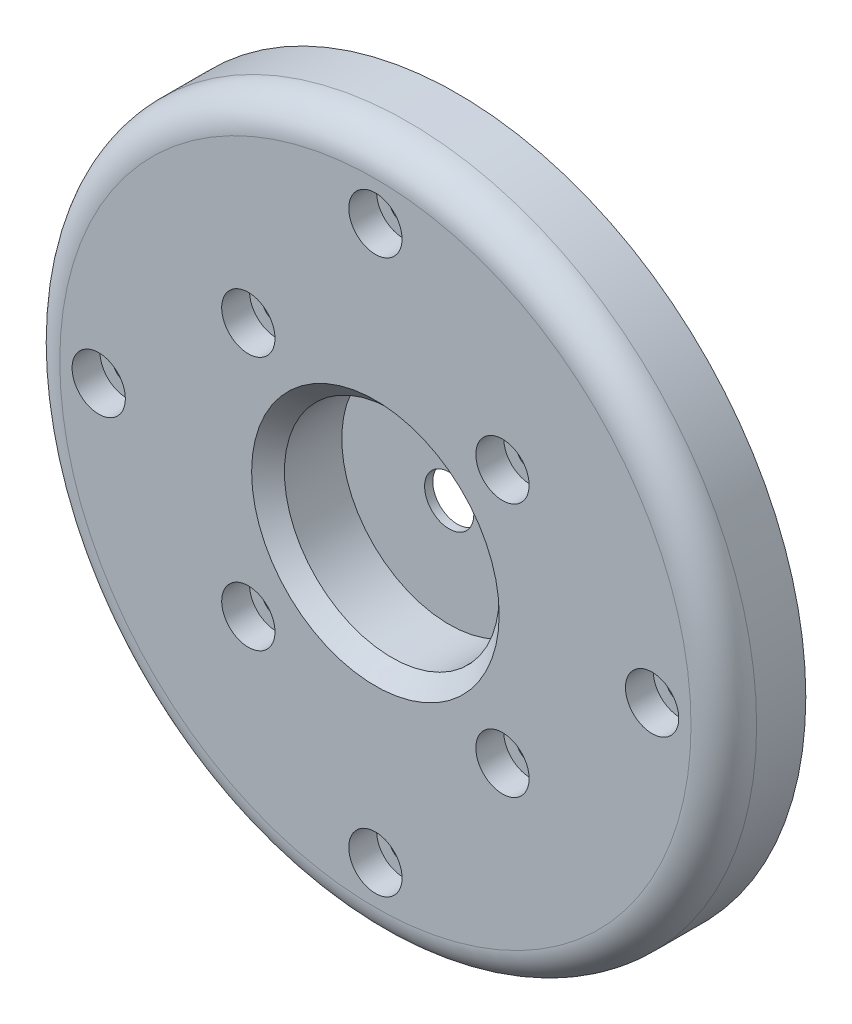
ISO-10303-21;
HEADER;
FILE_DESCRIPTION(('STEP AP214'),'2;1');
FILE_NAME('part.step','',(''),(''),'','','');
FILE_SCHEMA(('AUTOMOTIVE_DESIGN { 1 0 10303 214 1 1 1 1 }'));
ENDSEC;
DATA;
#1=APPLICATION_CONTEXT('core data for automotive mechanical design processes');
#2=APPLICATION_PROTOCOL_DEFINITION('international standard','automotive_design',2000,#1);
#3=PRODUCT_CONTEXT('',#1,'mechanical');
#4=PRODUCT('Part','Part','',(#3));
#5=PRODUCT_RELATED_PRODUCT_CATEGORY('part','',(#4));
#6=PRODUCT_DEFINITION_FORMATION('','',#4);
#7=PRODUCT_DEFINITION_CONTEXT('part definition',#1,'design');
#8=PRODUCT_DEFINITION('design','',#6,#7);
#9=PRODUCT_DEFINITION_SHAPE('','',#8);
#10=(LENGTH_UNIT() NAMED_UNIT(*) SI_UNIT(.MILLI.,.METRE.));
#11=(NAMED_UNIT(*) PLANE_ANGLE_UNIT() SI_UNIT($,.RADIAN.));
#12=(NAMED_UNIT(*) SI_UNIT($,.STERADIAN.) SOLID_ANGLE_UNIT());
#13=UNCERTAINTY_MEASURE_WITH_UNIT(LENGTH_MEASURE(1.E-05),#10,'distance_accuracy_value','');
#14=(GEOMETRIC_REPRESENTATION_CONTEXT(3) GLOBAL_UNCERTAINTY_ASSIGNED_CONTEXT((#13)) GLOBAL_UNIT_ASSIGNED_CONTEXT((#10,
#11,#12)) REPRESENTATION_CONTEXT('',''));
#15=CARTESIAN_POINT('',(0.,0.,0.));
#16=DIRECTION('',(0.,0.,1.));
#17=DIRECTION('',(1.,0.,0.));
#18=AXIS2_PLACEMENT_3D('',#15,#16,#17);
#19=CARTESIAN_POINT('',(0.,0.,-8.48528137423857));
#20=DIRECTION('',(0.,0.,1.));
#21=DIRECTION('',(1.,0.,0.));
#22=AXIS2_PLACEMENT_3D('',#19,#20,#21);
#23=CYLINDRICAL_SURFACE('',#22,3.);
#24=CARTESIAN_POINT('',(0.,0.,0.));
#25=DIRECTION('',(0.,0.,1.));
#26=DIRECTION('',(1.,0.,0.));
#27=AXIS2_PLACEMENT_3D('',#24,#25,#26);
#28=CIRCLE('',#27,3.);
#29=CARTESIAN_POINT('',(3.,0.,0.));
#30=VERTEX_POINT('',#29);
#31=EDGE_CURVE('E70',#30,#30,#28,.F.);
#32=ORIENTED_EDGE('',*,*,#31,.T.);
#33=EDGE_LOOP('',(#32));
#34=FACE_BOUND('',#33,.T.);
#35=CARTESIAN_POINT('',(0.,0.,1.));
#36=DIRECTION('',(0.,0.,1.));
#37=DIRECTION('',(1.,0.,0.));
#38=AXIS2_PLACEMENT_3D('',#35,#36,#37);
#39=CIRCLE('',#38,3.);
#40=CARTESIAN_POINT('',(3.,0.,1.));
#41=VERTEX_POINT('',#40);
#42=EDGE_CURVE('E63',#41,#41,#39,.F.);
#43=ORIENTED_EDGE('',*,*,#42,.F.);
#44=EDGE_LOOP('',(#43));
#45=FACE_BOUND('',#44,.T.);
#46=ADVANCED_FACE('F41',(#34,#45),#23,.F.);
#47=CARTESIAN_POINT('',(0.,0.,10.));
#48=DIRECTION('',(0.,0.,-1.));
#49=DIRECTION('',(-1.,0.,0.));
#50=AXIS2_PLACEMENT_3D('',#47,#48,#49);
#51=CYLINDRICAL_SURFACE('',#50,42.5);
#52=CARTESIAN_POINT('',(0.,0.,6.));
#53=DIRECTION('',(0.,0.,1.));
#54=DIRECTION('',(1.,0.,0.));
#55=AXIS2_PLACEMENT_3D('',#52,#53,#54);
#56=CIRCLE('',#55,42.5);
#57=CARTESIAN_POINT('',(42.5,0.,6.));
#58=VERTEX_POINT('',#57);
#59=EDGE_CURVE('E53',#58,#58,#56,.F.);
#60=ORIENTED_EDGE('',*,*,#59,.T.);
#61=EDGE_LOOP('',(#60));
#62=FACE_BOUND('',#61,.T.);
#63=CARTESIAN_POINT('',(0.,0.,0.));
#64=DIRECTION('',(0.,0.,1.));
#65=DIRECTION('',(1.,0.,0.));
#66=AXIS2_PLACEMENT_3D('',#63,#64,#65);
#67=CIRCLE('',#66,42.5);
#68=CARTESIAN_POINT('',(42.5,0.,0.));
#69=VERTEX_POINT('',#68);
#70=EDGE_CURVE('E62',#69,#69,#67,.T.);
#71=ORIENTED_EDGE('',*,*,#70,.T.);
#72=EDGE_LOOP('',(#71));
#73=FACE_BOUND('',#72,.T.);
#74=ADVANCED_FACE('F189',(#62,#73),#51,.T.);
#75=CARTESIAN_POINT('',(0.,0.,10.));
#76=DIRECTION('',(0.,0.,1.));
#77=DIRECTION('',(1.,0.,0.));
#78=AXIS2_PLACEMENT_3D('',#75,#76,#77);
#79=PLANE('',#78);
#80=CARTESIAN_POINT('',(0.,0.,10.));
#81=DIRECTION('',(0.,0.,1.));
#82=DIRECTION('',(1.,0.,0.));
#83=AXIS2_PLACEMENT_3D('',#80,#81,#82);
#84=CIRCLE('',#83,15.1);
#85=CARTESIAN_POINT('',(15.1,0.,10.));
#86=VERTEX_POINT('',#85);
#87=EDGE_CURVE('E10',#86,#86,#84,.F.);
#88=ORIENTED_EDGE('',*,*,#87,.T.);
#89=EDGE_LOOP('',(#88));
#90=FACE_BOUND('',#89,.T.);
#91=CARTESIAN_POINT('',(0.,0.,10.));
#92=DIRECTION('',(0.,0.,1.));
#93=DIRECTION('',(1.,0.,0.));
#94=AXIS2_PLACEMENT_3D('',#91,#92,#93);
#95=CIRCLE('',#94,38.5);
#96=CARTESIAN_POINT('',(38.5,0.,10.));
#97=VERTEX_POINT('',#96);
#98=EDGE_CURVE('E57',#97,#97,#95,.T.);
#99=ORIENTED_EDGE('',*,*,#98,.T.);
#100=EDGE_LOOP('',(#99));
#101=FACE_BOUND('',#100,.T.);
#102=CARTESIAN_POINT('',(-3.49379302610745E-13,-33.75,10.));
#103=DIRECTION('',(0.,0.,1.));
#104=DIRECTION('',(0.,1.,0.));
#105=AXIS2_PLACEMENT_3D('',#102,#103,#104);
#106=CIRCLE('',#105,3.25);
#107=CARTESIAN_POINT('',(-3.15337359557024E-13,-30.5,10.));
#108=VERTEX_POINT('',#107);
#109=EDGE_CURVE('E104',#108,#108,#106,.T.);
#110=ORIENTED_EDGE('',*,*,#109,.F.);
#111=EDGE_LOOP('',(#110));
#112=FACE_BOUND('',#111,.T.);
#113=CARTESIAN_POINT('',(1.13704312238833E-13,33.75,10.));
#114=DIRECTION('',(0.,0.,1.));
#115=DIRECTION('',(0.,-1.,0.));
#116=AXIS2_PLACEMENT_3D('',#113,#114,#115);
#117=CIRCLE('',#116,3.25);
#118=CARTESIAN_POINT('',(1.02356997887593E-13,30.5,10.));
#119=VERTEX_POINT('',#118);
#120=EDGE_CURVE('E119',#119,#119,#117,.T.);
#121=ORIENTED_EDGE('',*,*,#120,.F.);
#122=EDGE_LOOP('',(#121));
#123=FACE_BOUND('',#122,.T.);
#124=CARTESIAN_POINT('',(15.5,-15.5,10.));
#125=DIRECTION('',(0.,0.,1.));
#126=DIRECTION('',(-1.,0.,0.));
#127=AXIS2_PLACEMENT_3D('',#124,#125,#126);
#128=CIRCLE('',#127,3.25);
#129=CARTESIAN_POINT('',(12.25,-15.5,10.));
#130=VERTEX_POINT('',#129);
#131=EDGE_CURVE('E112',#130,#130,#128,.T.);
#132=ORIENTED_EDGE('',*,*,#131,.F.);
#133=EDGE_LOOP('',(#132));
#134=FACE_BOUND('',#133,.T.);
#135=CARTESIAN_POINT('',(33.75,0.,10.));
#136=DIRECTION('',(0.,0.,1.));
#137=DIRECTION('',(-1.,0.,0.));
#138=AXIS2_PLACEMENT_3D('',#135,#136,#137);
#139=CIRCLE('',#138,3.25);
#140=CARTESIAN_POINT('',(30.5,0.,10.));
#141=VERTEX_POINT('',#140);
#142=EDGE_CURVE('E129',#141,#141,#139,.T.);
#143=ORIENTED_EDGE('',*,*,#142,.F.);
#144=EDGE_LOOP('',(#143));
#145=FACE_BOUND('',#144,.T.);
#146=CARTESIAN_POINT('',(-15.5000000000002,-15.4999999999998,10.));
#147=DIRECTION('',(0.,0.,1.));
#148=DIRECTION('',(0.,1.,0.));
#149=AXIS2_PLACEMENT_3D('',#146,#147,#148);
#150=CIRCLE('',#149,3.25);
#151=CARTESIAN_POINT('',(-15.5000000000001,-12.2499999999998,10.));
#152=VERTEX_POINT('',#151);
#153=EDGE_CURVE('E111',#152,#152,#150,.T.);
#154=ORIENTED_EDGE('',*,*,#153,.F.);
#155=EDGE_LOOP('',(#154));
#156=FACE_BOUND('',#155,.T.);
#157=CARTESIAN_POINT('',(15.5000000000001,15.4999999999999,10.));
#158=DIRECTION('',(0.,0.,1.));
#159=DIRECTION('',(0.,-1.,0.));
#160=AXIS2_PLACEMENT_3D('',#157,#158,#159);
#161=CIRCLE('',#160,3.25);
#162=CARTESIAN_POINT('',(15.5,12.2499999999999,10.));
#163=VERTEX_POINT('',#162);
#164=EDGE_CURVE('E98',#163,#163,#161,.T.);
#165=ORIENTED_EDGE('',*,*,#164,.F.);
#166=EDGE_LOOP('',(#165));
#167=FACE_BOUND('',#166,.T.);
#168=CARTESIAN_POINT('',(-15.5,15.5,10.));
#169=DIRECTION('',(0.,0.,1.));
#170=DIRECTION('',(1.,0.,0.));
#171=AXIS2_PLACEMENT_3D('',#168,#169,#170);
#172=CIRCLE('',#171,3.25);
#173=CARTESIAN_POINT('',(-12.25,15.5,10.));
#174=VERTEX_POINT('',#173);
#175=EDGE_CURVE('E81',#174,#174,#172,.T.);
#176=ORIENTED_EDGE('',*,*,#175,.F.);
#177=EDGE_LOOP('',(#176));
#178=FACE_BOUND('',#177,.T.);
#179=CARTESIAN_POINT('',(-33.75,0.,10.));
#180=DIRECTION('',(0.,0.,1.));
#181=DIRECTION('',(1.,0.,0.));
#182=AXIS2_PLACEMENT_3D('',#179,#180,#181);
#183=CIRCLE('',#182,3.25);
#184=CARTESIAN_POINT('',(-30.5,0.,10.));
#185=VERTEX_POINT('',#184);
#186=EDGE_CURVE('E77',#185,#185,#183,.T.);
#187=ORIENTED_EDGE('',*,*,#186,.F.);
#188=EDGE_LOOP('',(#187));
#189=FACE_BOUND('',#188,.T.);
#190=ADVANCED_FACE('F196',(#90,#101,#112,#123,#134,#145,#156,#167,#178,#189),#79,.T.);
#191=CARTESIAN_POINT('',(0.,0.,0.));
#192=DIRECTION('',(0.,0.,1.));
#193=DIRECTION('',(1.,0.,0.));
#194=AXIS2_PLACEMENT_3D('',#191,#192,#193);
#195=PLANE('',#194);
#196=CARTESIAN_POINT('',(-3.49379302610745E-13,-33.75,0.));
#197=DIRECTION('',(0.,0.,1.));
#198=DIRECTION('',(1.,0.,0.));
#199=AXIS2_PLACEMENT_3D('',#196,#197,#198);
#200=CIRCLE('',#199,1.7);
#201=CARTESIAN_POINT('',(1.69999999999965,-33.75,0.));
#202=VERTEX_POINT('',#201);
#203=EDGE_CURVE('E140',#202,#202,#200,.F.);
#204=ORIENTED_EDGE('',*,*,#203,.F.);
#205=EDGE_LOOP('',(#204));
#206=FACE_BOUND('',#205,.T.);
#207=CARTESIAN_POINT('',(1.13704312238833E-13,33.75,0.));
#208=DIRECTION('',(0.,0.,1.));
#209=DIRECTION('',(1.,0.,0.));
#210=AXIS2_PLACEMENT_3D('',#207,#208,#209);
#211=CIRCLE('',#210,1.7);
#212=CARTESIAN_POINT('',(1.70000000000011,33.75,0.));
#213=VERTEX_POINT('',#212);
#214=EDGE_CURVE('E139',#213,#213,#211,.F.);
#215=ORIENTED_EDGE('',*,*,#214,.F.);
#216=EDGE_LOOP('',(#215));
#217=FACE_BOUND('',#216,.T.);
#218=CARTESIAN_POINT('',(15.5,-15.5,0.));
#219=DIRECTION('',(0.,0.,1.));
#220=DIRECTION('',(1.,0.,0.));
#221=AXIS2_PLACEMENT_3D('',#218,#219,#220);
#222=CIRCLE('',#221,1.7);
#223=CARTESIAN_POINT('',(17.2,-15.5,0.));
#224=VERTEX_POINT('',#223);
#225=EDGE_CURVE('E146',#224,#224,#222,.F.);
#226=ORIENTED_EDGE('',*,*,#225,.F.);
#227=EDGE_LOOP('',(#226));
#228=FACE_BOUND('',#227,.T.);
#229=CARTESIAN_POINT('',(33.75,0.,0.));
#230=DIRECTION('',(0.,0.,1.));
#231=DIRECTION('',(1.,0.,0.));
#232=AXIS2_PLACEMENT_3D('',#229,#230,#231);
#233=CIRCLE('',#232,1.7);
#234=CARTESIAN_POINT('',(35.45,0.,0.));
#235=VERTEX_POINT('',#234);
#236=EDGE_CURVE('E153',#235,#235,#233,.F.);
#237=ORIENTED_EDGE('',*,*,#236,.F.);
#238=EDGE_LOOP('',(#237));
#239=FACE_BOUND('',#238,.T.);
#240=CARTESIAN_POINT('',(-15.5000000000002,-15.4999999999998,0.));
#241=DIRECTION('',(0.,0.,1.));
#242=DIRECTION('',(1.,0.,0.));
#243=AXIS2_PLACEMENT_3D('',#240,#241,#242);
#244=CIRCLE('',#243,1.7);
#245=CARTESIAN_POINT('',(-13.8000000000002,-15.4999999999998,0.));
#246=VERTEX_POINT('',#245);
#247=EDGE_CURVE('E158',#246,#246,#244,.F.);
#248=ORIENTED_EDGE('',*,*,#247,.F.);
#249=EDGE_LOOP('',(#248));
#250=FACE_BOUND('',#249,.T.);
#251=CARTESIAN_POINT('',(15.5000000000001,15.4999999999999,0.));
#252=DIRECTION('',(0.,0.,1.));
#253=DIRECTION('',(1.,0.,0.));
#254=AXIS2_PLACEMENT_3D('',#251,#252,#253);
#255=CIRCLE('',#254,1.7);
#256=CARTESIAN_POINT('',(17.2000000000001,15.4999999999999,0.));
#257=VERTEX_POINT('',#256);
#258=EDGE_CURVE('E108',#257,#257,#255,.F.);
#259=ORIENTED_EDGE('',*,*,#258,.F.);
#260=EDGE_LOOP('',(#259));
#261=FACE_BOUND('',#260,.T.);
#262=CARTESIAN_POINT('',(-15.5,15.5,0.));
#263=DIRECTION('',(0.,0.,1.));
#264=DIRECTION('',(1.,0.,0.));
#265=AXIS2_PLACEMENT_3D('',#262,#263,#264);
#266=CIRCLE('',#265,1.7);
#267=CARTESIAN_POINT('',(-13.8,15.5,0.));
#268=VERTEX_POINT('',#267);
#269=EDGE_CURVE('E78',#268,#268,#266,.F.);
#270=ORIENTED_EDGE('',*,*,#269,.F.);
#271=EDGE_LOOP('',(#270));
#272=FACE_BOUND('',#271,.T.);
#273=CARTESIAN_POINT('',(-33.75,0.,0.));
#274=DIRECTION('',(0.,0.,1.));
#275=DIRECTION('',(1.,0.,0.));
#276=AXIS2_PLACEMENT_3D('',#273,#274,#275);
#277=CIRCLE('',#276,1.7);
#278=CARTESIAN_POINT('',(-32.05,0.,0.));
#279=VERTEX_POINT('',#278);
#280=EDGE_CURVE('E90',#279,#279,#277,.F.);
#281=ORIENTED_EDGE('',*,*,#280,.F.);
#282=EDGE_LOOP('',(#281));
#283=FACE_BOUND('',#282,.T.);
#284=ORIENTED_EDGE('',*,*,#31,.F.);
#285=EDGE_LOOP('',(#284));
#286=FACE_BOUND('',#285,.T.);
#287=ORIENTED_EDGE('',*,*,#70,.F.);
#288=EDGE_LOOP('',(#287));
#289=FACE_BOUND('',#288,.T.);
#290=ADVANCED_FACE('F205',(#206,#217,#228,#239,#250,#261,#272,#283,#286,#289),#195,.F.);
#291=CARTESIAN_POINT('',(-33.75,0.,6.6));
#292=DIRECTION('',(0.,0.,1.));
#293=DIRECTION('',(1.,0.,0.));
#294=AXIS2_PLACEMENT_3D('',#291,#292,#293);
#295=CYLINDRICAL_SURFACE('',#294,3.25);
#296=CARTESIAN_POINT('',(-33.75,0.,6.6));
#297=DIRECTION('',(0.,0.,1.));
#298=DIRECTION('',(1.,0.,0.));
#299=AXIS2_PLACEMENT_3D('',#296,#297,#298);
#300=CIRCLE('',#299,3.25);
#301=CARTESIAN_POINT('',(-30.5,0.,6.6));
#302=VERTEX_POINT('',#301);
#303=EDGE_CURVE('E74',#302,#302,#300,.T.);
#304=ORIENTED_EDGE('',*,*,#303,.F.);
#305=EDGE_LOOP('',(#304));
#306=FACE_BOUND('',#305,.T.);
#307=ORIENTED_EDGE('',*,*,#186,.T.);
#308=EDGE_LOOP('',(#307));
#309=FACE_BOUND('',#308,.T.);
#310=ADVANCED_FACE('F207',(#306,#309),#295,.F.);
#311=CARTESIAN_POINT('',(-33.75,0.,6.6));
#312=DIRECTION('',(0.,0.,1.));
#313=DIRECTION('',(1.,0.,0.));
#314=AXIS2_PLACEMENT_3D('',#311,#312,#313);
#315=PLANE('',#314);
#316=CARTESIAN_POINT('',(-33.75,0.,6.6));
#317=DIRECTION('',(0.,0.,1.));
#318=DIRECTION('',(1.,0.,0.));
#319=AXIS2_PLACEMENT_3D('',#316,#317,#318);
#320=CIRCLE('',#319,1.7);
#321=CARTESIAN_POINT('',(-32.05,0.,6.6));
#322=VERTEX_POINT('',#321);
#323=EDGE_CURVE('E86',#322,#322,#320,.T.);
#324=ORIENTED_EDGE('',*,*,#323,.F.);
#325=EDGE_LOOP('',(#324));
#326=FACE_BOUND('',#325,.T.);
#327=ORIENTED_EDGE('',*,*,#303,.T.);
#328=EDGE_LOOP('',(#327));
#329=FACE_BOUND('',#328,.T.);
#330=ADVANCED_FACE('F202',(#326,#329),#315,.T.);
#331=CARTESIAN_POINT('',(-15.5,15.5,6.6));
#332=DIRECTION('',(0.,0.,1.));
#333=DIRECTION('',(1.,0.,0.));
#334=AXIS2_PLACEMENT_3D('',#331,#332,#333);
#335=CYLINDRICAL_SURFACE('',#334,3.25);
#336=CARTESIAN_POINT('',(-15.5,15.5,6.6));
#337=DIRECTION('',(0.,0.,1.));
#338=DIRECTION('',(1.,0.,0.));
#339=AXIS2_PLACEMENT_3D('',#336,#337,#338);
#340=CIRCLE('',#339,3.25);
#341=CARTESIAN_POINT('',(-12.25,15.5,6.6));
#342=VERTEX_POINT('',#341);
#343=EDGE_CURVE('E73',#342,#342,#340,.T.);
#344=ORIENTED_EDGE('',*,*,#343,.F.);
#345=EDGE_LOOP('',(#344));
#346=FACE_BOUND('',#345,.T.);
#347=ORIENTED_EDGE('',*,*,#175,.T.);
#348=EDGE_LOOP('',(#347));
#349=FACE_BOUND('',#348,.T.);
#350=ADVANCED_FACE('F246',(#346,#349),#335,.F.);
#351=CARTESIAN_POINT('',(-15.5,15.5,6.6));
#352=DIRECTION('',(0.,0.,1.));
#353=DIRECTION('',(1.,0.,0.));
#354=AXIS2_PLACEMENT_3D('',#351,#352,#353);
#355=PLANE('',#354);
#356=CARTESIAN_POINT('',(-15.5,15.5,6.6));
#357=DIRECTION('',(0.,0.,1.));
#358=DIRECTION('',(1.,0.,0.));
#359=AXIS2_PLACEMENT_3D('',#356,#357,#358);
#360=CIRCLE('',#359,1.7);
#361=CARTESIAN_POINT('',(-13.8,15.5,6.6));
#362=VERTEX_POINT('',#361);
#363=EDGE_CURVE('E89',#362,#362,#360,.T.);
#364=ORIENTED_EDGE('',*,*,#363,.F.);
#365=EDGE_LOOP('',(#364));
#366=FACE_BOUND('',#365,.T.);
#367=ORIENTED_EDGE('',*,*,#343,.T.);
#368=EDGE_LOOP('',(#367));
#369=FACE_BOUND('',#368,.T.);
#370=ADVANCED_FACE('F240',(#366,#369),#355,.T.);
#371=CARTESIAN_POINT('',(-33.75,0.,-4.80832611206852));
#372=DIRECTION('',(0.,0.,1.));
#373=DIRECTION('',(1.,0.,0.));
#374=AXIS2_PLACEMENT_3D('',#371,#372,#373);
#375=CYLINDRICAL_SURFACE('',#374,1.7);
#376=ORIENTED_EDGE('',*,*,#280,.T.);
#377=EDGE_LOOP('',(#376));
#378=FACE_BOUND('',#377,.T.);
#379=ORIENTED_EDGE('',*,*,#323,.T.);
#380=EDGE_LOOP('',(#379));
#381=FACE_BOUND('',#380,.T.);
#382=ADVANCED_FACE('F236',(#378,#381),#375,.F.);
#383=CARTESIAN_POINT('',(-15.5,15.5,-4.80832611206852));
#384=DIRECTION('',(0.,0.,1.));
#385=DIRECTION('',(1.,0.,0.));
#386=AXIS2_PLACEMENT_3D('',#383,#384,#385);
#387=CYLINDRICAL_SURFACE('',#386,1.7);
#388=ORIENTED_EDGE('',*,*,#269,.T.);
#389=EDGE_LOOP('',(#388));
#390=FACE_BOUND('',#389,.T.);
#391=ORIENTED_EDGE('',*,*,#363,.T.);
#392=EDGE_LOOP('',(#391));
#393=FACE_BOUND('',#392,.T.);
#394=ADVANCED_FACE('F239',(#390,#393),#387,.F.);
#395=CARTESIAN_POINT('',(15.5000000000001,15.4999999999999,6.6));
#396=DIRECTION('',(0.,0.,1.));
#397=DIRECTION('',(1.,0.,0.));
#398=AXIS2_PLACEMENT_3D('',#395,#396,#397);
#399=CYLINDRICAL_SURFACE('',#398,3.25);
#400=CARTESIAN_POINT('',(15.5000000000001,15.4999999999999,6.6));
#401=DIRECTION('',(0.,0.,1.));
#402=DIRECTION('',(0.,-1.,0.));
#403=AXIS2_PLACEMENT_3D('',#400,#401,#402);
#404=CIRCLE('',#403,3.25);
#405=CARTESIAN_POINT('',(15.5,12.2499999999999,6.6));
#406=VERTEX_POINT('',#405);
#407=EDGE_CURVE('E93',#406,#406,#404,.T.);
#408=ORIENTED_EDGE('',*,*,#407,.F.);
#409=EDGE_LOOP('',(#408));
#410=FACE_BOUND('',#409,.T.);
#411=ORIENTED_EDGE('',*,*,#164,.T.);
#412=EDGE_LOOP('',(#411));
#413=FACE_BOUND('',#412,.T.);
#414=ADVANCED_FACE('F265',(#410,#413),#399,.F.);
#415=CARTESIAN_POINT('',(15.5000000000001,15.4999999999999,6.6));
#416=DIRECTION('',(0.,0.,1.));
#417=DIRECTION('',(0.,-1.,0.));
#418=AXIS2_PLACEMENT_3D('',#415,#416,#417);
#419=PLANE('',#418);
#420=CARTESIAN_POINT('',(15.5000000000001,15.4999999999999,6.6));
#421=DIRECTION('',(0.,0.,1.));
#422=DIRECTION('',(0.,-1.,0.));
#423=AXIS2_PLACEMENT_3D('',#420,#421,#422);
#424=CIRCLE('',#423,1.7);
#425=CARTESIAN_POINT('',(15.5000000000001,13.7999999999999,6.6));
#426=VERTEX_POINT('',#425);
#427=EDGE_CURVE('E136',#426,#426,#424,.T.);
#428=ORIENTED_EDGE('',*,*,#427,.F.);
#429=EDGE_LOOP('',(#428));
#430=FACE_BOUND('',#429,.T.);
#431=ORIENTED_EDGE('',*,*,#407,.T.);
#432=EDGE_LOOP('',(#431));
#433=FACE_BOUND('',#432,.T.);
#434=ADVANCED_FACE('F268',(#430,#433),#419,.T.);
#435=CARTESIAN_POINT('',(-15.5000000000002,-15.4999999999998,6.6));
#436=DIRECTION('',(0.,0.,1.));
#437=DIRECTION('',(1.,0.,0.));
#438=AXIS2_PLACEMENT_3D('',#435,#436,#437);
#439=CYLINDRICAL_SURFACE('',#438,3.25);
#440=CARTESIAN_POINT('',(-15.5000000000002,-15.4999999999998,6.6));
#441=DIRECTION('',(0.,0.,1.));
#442=DIRECTION('',(0.,1.,0.));
#443=AXIS2_PLACEMENT_3D('',#440,#441,#442);
#444=CIRCLE('',#443,3.25);
#445=CARTESIAN_POINT('',(-15.5000000000001,-12.2499999999998,6.6));
#446=VERTEX_POINT('',#445);
#447=EDGE_CURVE('E126',#446,#446,#444,.T.);
#448=ORIENTED_EDGE('',*,*,#447,.F.);
#449=EDGE_LOOP('',(#448));
#450=FACE_BOUND('',#449,.T.);
#451=ORIENTED_EDGE('',*,*,#153,.T.);
#452=EDGE_LOOP('',(#451));
#453=FACE_BOUND('',#452,.T.);
#454=ADVANCED_FACE('F272',(#450,#453),#439,.F.);
#455=CARTESIAN_POINT('',(-15.5000000000002,-15.4999999999998,6.6));
#456=DIRECTION('',(0.,0.,1.));
#457=DIRECTION('',(0.,1.,0.));
#458=AXIS2_PLACEMENT_3D('',#455,#456,#457);
#459=PLANE('',#458);
#460=CARTESIAN_POINT('',(-15.5000000000002,-15.4999999999998,6.6));
#461=DIRECTION('',(0.,0.,1.));
#462=DIRECTION('',(0.,1.,0.));
#463=AXIS2_PLACEMENT_3D('',#460,#461,#462);
#464=CIRCLE('',#463,1.7);
#465=CARTESIAN_POINT('',(-15.5000000000001,-13.7999999999998,6.6));
#466=VERTEX_POINT('',#465);
#467=EDGE_CURVE('E143',#466,#466,#464,.T.);
#468=ORIENTED_EDGE('',*,*,#467,.F.);
#469=EDGE_LOOP('',(#468));
#470=FACE_BOUND('',#469,.T.);
#471=ORIENTED_EDGE('',*,*,#447,.T.);
#472=EDGE_LOOP('',(#471));
#473=FACE_BOUND('',#472,.T.);
#474=ADVANCED_FACE('F302',(#470,#473),#459,.T.);
#475=CARTESIAN_POINT('',(33.75,0.,6.6));
#476=DIRECTION('',(0.,0.,1.));
#477=DIRECTION('',(1.,0.,0.));
#478=AXIS2_PLACEMENT_3D('',#475,#476,#477);
#479=CYLINDRICAL_SURFACE('',#478,3.25);
#480=CARTESIAN_POINT('',(33.75,0.,6.6));
#481=DIRECTION('',(0.,0.,1.));
#482=DIRECTION('',(-1.,0.,0.));
#483=AXIS2_PLACEMENT_3D('',#480,#481,#482);
#484=CIRCLE('',#483,3.25);
#485=CARTESIAN_POINT('',(30.5,0.,6.6));
#486=VERTEX_POINT('',#485);
#487=EDGE_CURVE('E116',#486,#486,#484,.T.);
#488=ORIENTED_EDGE('',*,*,#487,.F.);
#489=EDGE_LOOP('',(#488));
#490=FACE_BOUND('',#489,.T.);
#491=ORIENTED_EDGE('',*,*,#142,.T.);
#492=EDGE_LOOP('',(#491));
#493=FACE_BOUND('',#492,.T.);
#494=ADVANCED_FACE('F306',(#490,#493),#479,.F.);
#495=CARTESIAN_POINT('',(33.75,0.,6.6));
#496=DIRECTION('',(0.,0.,1.));
#497=DIRECTION('',(-1.,0.,0.));
#498=AXIS2_PLACEMENT_3D('',#495,#496,#497);
#499=PLANE('',#498);
#500=CARTESIAN_POINT('',(33.75,0.,6.6));
#501=DIRECTION('',(0.,0.,1.));
#502=DIRECTION('',(-1.,0.,0.));
#503=AXIS2_PLACEMENT_3D('',#500,#501,#502);
#504=CIRCLE('',#503,1.7);
#505=CARTESIAN_POINT('',(32.05,0.,6.6));
#506=VERTEX_POINT('',#505);
#507=EDGE_CURVE('E161',#506,#506,#504,.T.);
#508=ORIENTED_EDGE('',*,*,#507,.F.);
#509=EDGE_LOOP('',(#508));
#510=FACE_BOUND('',#509,.T.);
#511=ORIENTED_EDGE('',*,*,#487,.T.);
#512=EDGE_LOOP('',(#511));
#513=FACE_BOUND('',#512,.T.);
#514=ADVANCED_FACE('F288',(#510,#513),#499,.T.);
#515=CARTESIAN_POINT('',(15.5,-15.5,6.6));
#516=DIRECTION('',(0.,0.,1.));
#517=DIRECTION('',(1.,0.,0.));
#518=AXIS2_PLACEMENT_3D('',#515,#516,#517);
#519=CYLINDRICAL_SURFACE('',#518,3.25);
#520=CARTESIAN_POINT('',(15.5,-15.5,6.6));
#521=DIRECTION('',(0.,0.,1.));
#522=DIRECTION('',(-1.,0.,0.));
#523=AXIS2_PLACEMENT_3D('',#520,#521,#522);
#524=CIRCLE('',#523,3.25);
#525=CARTESIAN_POINT('',(12.25,-15.5,6.6));
#526=VERTEX_POINT('',#525);
#527=EDGE_CURVE('E115',#526,#526,#524,.T.);
#528=ORIENTED_EDGE('',*,*,#527,.F.);
#529=EDGE_LOOP('',(#528));
#530=FACE_BOUND('',#529,.T.);
#531=ORIENTED_EDGE('',*,*,#131,.T.);
#532=EDGE_LOOP('',(#531));
#533=FACE_BOUND('',#532,.T.);
#534=ADVANCED_FACE('F284',(#530,#533),#519,.F.);
#535=CARTESIAN_POINT('',(15.5,-15.5,6.6));
#536=DIRECTION('',(0.,0.,1.));
#537=DIRECTION('',(-1.,0.,0.));
#538=AXIS2_PLACEMENT_3D('',#535,#536,#537);
#539=PLANE('',#538);
#540=CARTESIAN_POINT('',(15.5,-15.5,6.6));
#541=DIRECTION('',(0.,0.,1.));
#542=DIRECTION('',(-1.,0.,0.));
#543=AXIS2_PLACEMENT_3D('',#540,#541,#542);
#544=CIRCLE('',#543,1.7);
#545=CARTESIAN_POINT('',(13.8,-15.5,6.6));
#546=VERTEX_POINT('',#545);
#547=EDGE_CURVE('E150',#546,#546,#544,.T.);
#548=ORIENTED_EDGE('',*,*,#547,.F.);
#549=EDGE_LOOP('',(#548));
#550=FACE_BOUND('',#549,.T.);
#551=ORIENTED_EDGE('',*,*,#527,.T.);
#552=EDGE_LOOP('',(#551));
#553=FACE_BOUND('',#552,.T.);
#554=ADVANCED_FACE('F287',(#550,#553),#539,.T.);
#555=CARTESIAN_POINT('',(1.13704312238833E-13,33.75,6.6));
#556=DIRECTION('',(0.,0.,1.));
#557=DIRECTION('',(1.,0.,0.));
#558=AXIS2_PLACEMENT_3D('',#555,#556,#557);
#559=CYLINDRICAL_SURFACE('',#558,3.25);
#560=CARTESIAN_POINT('',(1.13704312238833E-13,33.75,6.6));
#561=DIRECTION('',(0.,0.,1.));
#562=DIRECTION('',(0.,-1.,0.));
#563=AXIS2_PLACEMENT_3D('',#560,#561,#562);
#564=CIRCLE('',#563,3.25);
#565=CARTESIAN_POINT('',(1.02356997887593E-13,30.5,6.6));
#566=VERTEX_POINT('',#565);
#567=EDGE_CURVE('E101',#566,#566,#564,.T.);
#568=ORIENTED_EDGE('',*,*,#567,.F.);
#569=EDGE_LOOP('',(#568));
#570=FACE_BOUND('',#569,.T.);
#571=ORIENTED_EDGE('',*,*,#120,.T.);
#572=EDGE_LOOP('',(#571));
#573=FACE_BOUND('',#572,.T.);
#574=ADVANCED_FACE('F292',(#570,#573),#559,.F.);
#575=CARTESIAN_POINT('',(1.13704312238833E-13,33.75,6.6));
#576=DIRECTION('',(0.,0.,1.));
#577=DIRECTION('',(0.,-1.,0.));
#578=AXIS2_PLACEMENT_3D('',#575,#576,#577);
#579=PLANE('',#578);
#580=CARTESIAN_POINT('',(1.13704312238833E-13,33.75,6.6));
#581=DIRECTION('',(0.,0.,1.));
#582=DIRECTION('',(0.,-1.,0.));
#583=AXIS2_PLACEMENT_3D('',#580,#581,#582);
#584=CIRCLE('',#583,1.7);
#585=CARTESIAN_POINT('',(1.077687939628E-13,32.05,6.6));
#586=VERTEX_POINT('',#585);
#587=EDGE_CURVE('E149',#586,#586,#584,.T.);
#588=ORIENTED_EDGE('',*,*,#587,.F.);
#589=EDGE_LOOP('',(#588));
#590=FACE_BOUND('',#589,.T.);
#591=ORIENTED_EDGE('',*,*,#567,.T.);
#592=EDGE_LOOP('',(#591));
#593=FACE_BOUND('',#592,.T.);
#594=ADVANCED_FACE('F278',(#590,#593),#579,.T.);
#595=CARTESIAN_POINT('',(-3.49379302610745E-13,-33.75,6.6));
#596=DIRECTION('',(0.,0.,1.));
#597=DIRECTION('',(1.,0.,0.));
#598=AXIS2_PLACEMENT_3D('',#595,#596,#597);
#599=CYLINDRICAL_SURFACE('',#598,3.25);
#600=CARTESIAN_POINT('',(-3.49379302610745E-13,-33.75,6.6));
#601=DIRECTION('',(0.,0.,1.));
#602=DIRECTION('',(0.,1.,0.));
#603=AXIS2_PLACEMENT_3D('',#600,#601,#602);
#604=CIRCLE('',#603,3.25);
#605=CARTESIAN_POINT('',(-3.15337359557024E-13,-30.5,6.6));
#606=VERTEX_POINT('',#605);
#607=EDGE_CURVE('E107',#606,#606,#604,.T.);
#608=ORIENTED_EDGE('',*,*,#607,.F.);
#609=EDGE_LOOP('',(#608));
#610=FACE_BOUND('',#609,.T.);
#611=ORIENTED_EDGE('',*,*,#109,.T.);
#612=EDGE_LOOP('',(#611));
#613=FACE_BOUND('',#612,.T.);
#614=ADVANCED_FACE('F274',(#610,#613),#599,.F.);
#615=CARTESIAN_POINT('',(-3.49379302610745E-13,-33.75,6.6));
#616=DIRECTION('',(0.,0.,1.));
#617=DIRECTION('',(0.,1.,0.));
#618=AXIS2_PLACEMENT_3D('',#615,#616,#617);
#619=PLANE('',#618);
#620=CARTESIAN_POINT('',(-3.49379302610745E-13,-33.75,6.6));
#621=DIRECTION('',(0.,0.,1.));
#622=DIRECTION('',(0.,1.,0.));
#623=AXIS2_PLACEMENT_3D('',#620,#621,#622);
#624=CIRCLE('',#623,1.7);
#625=CARTESIAN_POINT('',(-3.31572747782645E-13,-32.05,6.6));
#626=VERTEX_POINT('',#625);
#627=EDGE_CURVE('E66',#626,#626,#624,.T.);
#628=ORIENTED_EDGE('',*,*,#627,.F.);
#629=EDGE_LOOP('',(#628));
#630=FACE_BOUND('',#629,.T.);
#631=ORIENTED_EDGE('',*,*,#607,.T.);
#632=EDGE_LOOP('',(#631));
#633=FACE_BOUND('',#632,.T.);
#634=ADVANCED_FACE('F277',(#630,#633),#619,.T.);
#635=CARTESIAN_POINT('',(15.5000000000001,15.4999999999999,-4.80832611206852));
#636=DIRECTION('',(0.,0.,1.));
#637=DIRECTION('',(1.,0.,0.));
#638=AXIS2_PLACEMENT_3D('',#635,#636,#637);
#639=CYLINDRICAL_SURFACE('',#638,1.7);
#640=ORIENTED_EDGE('',*,*,#258,.T.);
#641=EDGE_LOOP('',(#640));
#642=FACE_BOUND('',#641,.T.);
#643=ORIENTED_EDGE('',*,*,#427,.T.);
#644=EDGE_LOOP('',(#643));
#645=FACE_BOUND('',#644,.T.);
#646=ADVANCED_FACE('F282',(#642,#645),#639,.F.);
#647=CARTESIAN_POINT('',(-15.5000000000002,-15.4999999999998,-4.80832611206852));
#648=DIRECTION('',(0.,0.,1.));
#649=DIRECTION('',(1.,0.,0.));
#650=AXIS2_PLACEMENT_3D('',#647,#648,#649);
#651=CYLINDRICAL_SURFACE('',#650,1.7);
#652=ORIENTED_EDGE('',*,*,#247,.T.);
#653=EDGE_LOOP('',(#652));
#654=FACE_BOUND('',#653,.T.);
#655=ORIENTED_EDGE('',*,*,#467,.T.);
#656=EDGE_LOOP('',(#655));
#657=FACE_BOUND('',#656,.T.);
#658=ADVANCED_FACE('F316',(#654,#657),#651,.F.);
#659=CARTESIAN_POINT('',(33.75,0.,-4.80832611206852));
#660=DIRECTION('',(0.,0.,1.));
#661=DIRECTION('',(1.,0.,0.));
#662=AXIS2_PLACEMENT_3D('',#659,#660,#661);
#663=CYLINDRICAL_SURFACE('',#662,1.7);
#664=ORIENTED_EDGE('',*,*,#236,.T.);
#665=EDGE_LOOP('',(#664));
#666=FACE_BOUND('',#665,.T.);
#667=ORIENTED_EDGE('',*,*,#507,.T.);
#668=EDGE_LOOP('',(#667));
#669=FACE_BOUND('',#668,.T.);
#670=ADVANCED_FACE('F324',(#666,#669),#663,.F.);
#671=CARTESIAN_POINT('',(15.5,-15.5,-4.80832611206852));
#672=DIRECTION('',(0.,0.,1.));
#673=DIRECTION('',(1.,0.,0.));
#674=AXIS2_PLACEMENT_3D('',#671,#672,#673);
#675=CYLINDRICAL_SURFACE('',#674,1.7);
#676=ORIENTED_EDGE('',*,*,#225,.T.);
#677=EDGE_LOOP('',(#676));
#678=FACE_BOUND('',#677,.T.);
#679=ORIENTED_EDGE('',*,*,#547,.T.);
#680=EDGE_LOOP('',(#679));
#681=FACE_BOUND('',#680,.T.);
#682=ADVANCED_FACE('F321',(#678,#681),#675,.F.);
#683=CARTESIAN_POINT('',(1.13704312238833E-13,33.75,-4.80832611206852));
#684=DIRECTION('',(0.,0.,1.));
#685=DIRECTION('',(1.,0.,0.));
#686=AXIS2_PLACEMENT_3D('',#683,#684,#685);
#687=CYLINDRICAL_SURFACE('',#686,1.7);
#688=ORIENTED_EDGE('',*,*,#214,.T.);
#689=EDGE_LOOP('',(#688));
#690=FACE_BOUND('',#689,.T.);
#691=ORIENTED_EDGE('',*,*,#587,.T.);
#692=EDGE_LOOP('',(#691));
#693=FACE_BOUND('',#692,.T.);
#694=ADVANCED_FACE('F319',(#690,#693),#687,.F.);
#695=CARTESIAN_POINT('',(-3.49379302610745E-13,-33.75,-4.80832611206852));
#696=DIRECTION('',(0.,0.,1.));
#697=DIRECTION('',(1.,0.,0.));
#698=AXIS2_PLACEMENT_3D('',#695,#696,#697);
#699=CYLINDRICAL_SURFACE('',#698,1.7);
#700=ORIENTED_EDGE('',*,*,#203,.T.);
#701=EDGE_LOOP('',(#700));
#702=FACE_BOUND('',#701,.T.);
#703=ORIENTED_EDGE('',*,*,#627,.T.);
#704=EDGE_LOOP('',(#703));
#705=FACE_BOUND('',#704,.T.);
#706=ADVANCED_FACE('F185',(#702,#705),#699,.F.);
#707=CARTESIAN_POINT('',(0.,0.,1.));
#708=DIRECTION('',(0.,0.,1.));
#709=DIRECTION('',(1.,0.,0.));
#710=AXIS2_PLACEMENT_3D('',#707,#708,#709);
#711=PLANE('',#710);
#712=CARTESIAN_POINT('',(0.,0.,1.));
#713=DIRECTION('',(0.,0.,1.));
#714=DIRECTION('',(1.,0.,0.));
#715=AXIS2_PLACEMENT_3D('',#712,#713,#714);
#716=CIRCLE('',#715,13.1);
#717=CARTESIAN_POINT('',(13.1,0.,1.));
#718=VERTEX_POINT('',#717);
#719=EDGE_CURVE('E67',#718,#718,#716,.T.);
#720=ORIENTED_EDGE('',*,*,#719,.T.);
#721=EDGE_LOOP('',(#720));
#722=FACE_BOUND('',#721,.T.);
#723=ORIENTED_EDGE('',*,*,#42,.T.);
#724=EDGE_LOOP('',(#723));
#725=FACE_BOUND('',#724,.T.);
#726=ADVANCED_FACE('F171',(#722,#725),#711,.T.);
#727=CARTESIAN_POINT('',(0.,0.,1.));
#728=DIRECTION('',(0.,0.,1.));
#729=DIRECTION('',(1.,0.,0.));
#730=AXIS2_PLACEMENT_3D('',#727,#728,#729);
#731=CYLINDRICAL_SURFACE('',#730,13.1);
#732=CARTESIAN_POINT('',(0.,0.,7.99999999999999));
#733=DIRECTION('',(0.,0.,1.));
#734=DIRECTION('',(1.,0.,0.));
#735=AXIS2_PLACEMENT_3D('',#732,#733,#734);
#736=CIRCLE('',#735,13.1);
#737=CARTESIAN_POINT('',(13.1,0.,7.99999999999999));
#738=VERTEX_POINT('',#737);
#739=EDGE_CURVE('E49',#738,#738,#736,.T.);
#740=ORIENTED_EDGE('',*,*,#739,.T.);
#741=EDGE_LOOP('',(#740));
#742=FACE_BOUND('',#741,.T.);
#743=ORIENTED_EDGE('',*,*,#719,.F.);
#744=EDGE_LOOP('',(#743));
#745=FACE_BOUND('',#744,.T.);
#746=ADVANCED_FACE('F174',(#742,#745),#731,.F.);
#747=CARTESIAN_POINT('',(0.,0.,6.));
#748=DIRECTION('',(0.,0.,1.));
#749=DIRECTION('',(1.,0.,0.));
#750=AXIS2_PLACEMENT_3D('',#747,#748,#749);
#751=TOROIDAL_SURFACE('',#750,38.5,4.);
#752=ORIENTED_EDGE('',*,*,#59,.F.);
#753=EDGE_LOOP('',(#752));
#754=FACE_BOUND('',#753,.T.);
#755=ORIENTED_EDGE('',*,*,#98,.F.);
#756=EDGE_LOOP('',(#755));
#757=FACE_BOUND('',#756,.T.);
#758=ADVANCED_FACE('F176',(#754,#757),#751,.T.);
#759=CARTESIAN_POINT('',(0.,0.,7.99999999999999));
#760=DIRECTION('',(0.,0.,1.));
#761=DIRECTION('',(1.,0.,0.));
#762=AXIS2_PLACEMENT_3D('',#759,#760,#761);
#763=CONICAL_SURFACE('',#762,13.1,0.78539816339745);
#764=ORIENTED_EDGE('',*,*,#87,.F.);
#765=EDGE_LOOP('',(#764));
#766=FACE_BOUND('',#765,.T.);
#767=ORIENTED_EDGE('',*,*,#739,.F.);
#768=EDGE_LOOP('',(#767));
#769=FACE_BOUND('',#768,.T.);
#770=ADVANCED_FACE('F44',(#766,#769),#763,.F.);
#771=CLOSED_SHELL('',(#46,#74,#190,#290,#310,#330,#350,#370,#382,#394,#414,#434,#454,#474,#494,
#514,#534,#554,#574,#594,#614,#634,#646,#658,#670,#682,#694,#706,#726,#746,#758,#770));
#772=MANIFOLD_SOLID_BREP('B2',#771);
#773=ADVANCED_BREP_SHAPE_REPRESENTATION('',(#18,#772),#14);
#774=SHAPE_DEFINITION_REPRESENTATION(#9,#773);
ENDSEC;
END-ISO-10303-21;
